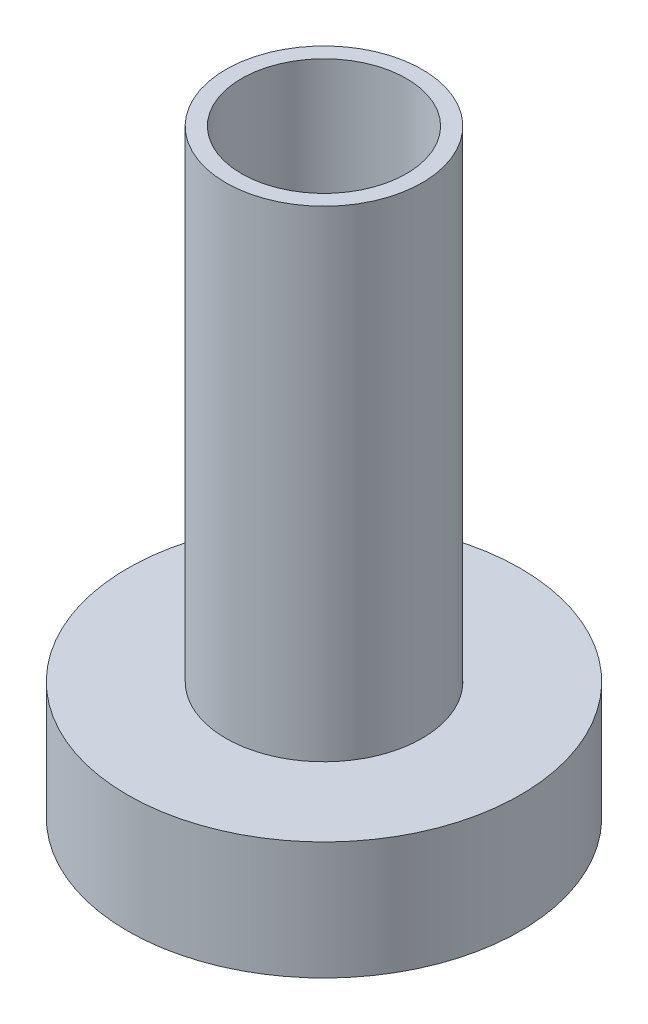
ISO-10303-21;
HEADER;
FILE_DESCRIPTION(('STEP AP214'),'2;1');
FILE_NAME('part.step','',(''),(''),'','','');
FILE_SCHEMA(('AUTOMOTIVE_DESIGN { 1 0 10303 214 1 1 1 1 }'));
ENDSEC;
DATA;
#1=APPLICATION_CONTEXT('core data for automotive mechanical design processes');
#2=APPLICATION_PROTOCOL_DEFINITION('international standard','automotive_design',2000,#1);
#3=PRODUCT_CONTEXT('',#1,'mechanical');
#4=PRODUCT('Part','Part','',(#3));
#5=PRODUCT_RELATED_PRODUCT_CATEGORY('part','',(#4));
#6=PRODUCT_DEFINITION_FORMATION('','',#4);
#7=PRODUCT_DEFINITION_CONTEXT('part definition',#1,'design');
#8=PRODUCT_DEFINITION('design','',#6,#7);
#9=PRODUCT_DEFINITION_SHAPE('','',#8);
#10=(LENGTH_UNIT() NAMED_UNIT(*) SI_UNIT(.MILLI.,.METRE.));
#11=(NAMED_UNIT(*) PLANE_ANGLE_UNIT() SI_UNIT($,.RADIAN.));
#12=(NAMED_UNIT(*) SI_UNIT($,.STERADIAN.) SOLID_ANGLE_UNIT());
#13=UNCERTAINTY_MEASURE_WITH_UNIT(LENGTH_MEASURE(1.E-05),#10,'distance_accuracy_value','');
#14=(GEOMETRIC_REPRESENTATION_CONTEXT(3) GLOBAL_UNCERTAINTY_ASSIGNED_CONTEXT((#13)) GLOBAL_UNIT_ASSIGNED_CONTEXT((#10,
#11,#12)) REPRESENTATION_CONTEXT('',''));
#15=CARTESIAN_POINT('',(0.,0.,0.));
#16=DIRECTION('',(0.,0.,1.));
#17=DIRECTION('',(1.,0.,0.));
#18=AXIS2_PLACEMENT_3D('',#15,#16,#17);
#19=CARTESIAN_POINT('',(0.,-10.,0.));
#20=DIRECTION('',(0.,1.,0.));
#21=DIRECTION('',(0.,0.,1.));
#22=AXIS2_PLACEMENT_3D('',#19,#20,#21);
#23=CYLINDRICAL_SURFACE('',#22,7.);
#24=CARTESIAN_POINT('',(0.,-10.,0.));
#25=DIRECTION('',(0.,1.,0.));
#26=DIRECTION('',(0.,0.,1.));
#27=AXIS2_PLACEMENT_3D('',#24,#25,#26);
#28=CIRCLE('',#27,7.);
#29=CARTESIAN_POINT('',(0.,-10.,7.));
#30=VERTEX_POINT('',#29);
#31=EDGE_CURVE('E11',#30,#30,#28,.T.);
#32=ORIENTED_EDGE('',*,*,#31,.F.);
#33=EDGE_LOOP('',(#32));
#34=FACE_BOUND('',#33,.T.);
#35=CARTESIAN_POINT('',(0.,0.,0.));
#36=DIRECTION('',(0.,1.,0.));
#37=DIRECTION('',(0.,0.,1.));
#38=AXIS2_PLACEMENT_3D('',#35,#36,#37);
#39=CIRCLE('',#38,7.);
#40=CARTESIAN_POINT('',(0.,0.,7.));
#41=VERTEX_POINT('',#40);
#42=EDGE_CURVE('E54',#41,#41,#39,.T.);
#43=ORIENTED_EDGE('',*,*,#42,.T.);
#44=EDGE_LOOP('',(#43));
#45=FACE_BOUND('',#44,.T.);
#46=ADVANCED_FACE('F51',(#34,#45),#23,.F.);
#47=CARTESIAN_POINT('',(0.,-10.,0.));
#48=DIRECTION('',(0.,1.,0.));
#49=DIRECTION('',(0.,0.,1.));
#50=AXIS2_PLACEMENT_3D('',#47,#48,#49);
#51=PLANE('',#50);
#52=ORIENTED_EDGE('',*,*,#31,.T.);
#53=EDGE_LOOP('',(#52));
#54=FACE_BOUND('',#53,.T.);
#55=CARTESIAN_POINT('',(0.,-10.,0.));
#56=DIRECTION('',(0.,-1.,0.));
#57=DIRECTION('',(0.,0.,-1.));
#58=AXIS2_PLACEMENT_3D('',#55,#56,#57);
#59=CIRCLE('',#58,50.);
#60=CARTESIAN_POINT('',(0.,-10.,-50.));
#61=VERTEX_POINT('',#60);
#62=EDGE_CURVE('E66',#61,#61,#59,.T.);
#63=ORIENTED_EDGE('',*,*,#62,.T.);
#64=EDGE_LOOP('',(#63));
#65=FACE_BOUND('',#64,.T.);
#66=ADVANCED_FACE('F89',(#54,#65),#51,.F.);
#67=CARTESIAN_POINT('',(0.,0.,0.));
#68=DIRECTION('',(0.,1.,0.));
#69=DIRECTION('',(0.,0.,1.));
#70=AXIS2_PLACEMENT_3D('',#67,#68,#69);
#71=PLANE('',#70);
#72=ORIENTED_EDGE('',*,*,#42,.F.);
#73=EDGE_LOOP('',(#72));
#74=FACE_BOUND('',#73,.T.);
#75=CARTESIAN_POINT('',(0.,0.,0.));
#76=DIRECTION('',(0.,1.,0.));
#77=DIRECTION('',(0.,0.,1.));
#78=AXIS2_PLACEMENT_3D('',#75,#76,#77);
#79=CIRCLE('',#78,25.);
#80=CARTESIAN_POINT('',(0.,0.,25.));
#81=VERTEX_POINT('',#80);
#82=EDGE_CURVE('E61',#81,#81,#79,.T.);
#83=ORIENTED_EDGE('',*,*,#82,.T.);
#84=EDGE_LOOP('',(#83));
#85=FACE_BOUND('',#84,.T.);
#86=ADVANCED_FACE('F94',(#74,#85),#71,.T.);
#87=CARTESIAN_POINT('',(0.,20.,0.));
#88=DIRECTION('',(0.,-1.,0.));
#89=DIRECTION('',(0.,0.,-1.));
#90=AXIS2_PLACEMENT_3D('',#87,#88,#89);
#91=CYLINDRICAL_SURFACE('',#90,50.);
#92=CARTESIAN_POINT('',(0.,20.,0.));
#93=DIRECTION('',(0.,-1.,0.));
#94=DIRECTION('',(0.,0.,-1.));
#95=AXIS2_PLACEMENT_3D('',#92,#93,#94);
#96=CIRCLE('',#95,50.);
#97=CARTESIAN_POINT('',(0.,20.,-50.));
#98=VERTEX_POINT('',#97);
#99=EDGE_CURVE('E65',#98,#98,#96,.T.);
#100=ORIENTED_EDGE('',*,*,#99,.T.);
#101=EDGE_LOOP('',(#100));
#102=FACE_BOUND('',#101,.T.);
#103=ORIENTED_EDGE('',*,*,#62,.F.);
#104=EDGE_LOOP('',(#103));
#105=FACE_BOUND('',#104,.T.);
#106=ADVANCED_FACE('F85',(#102,#105),#91,.T.);
#107=CARTESIAN_POINT('',(0.,20.,0.));
#108=DIRECTION('',(0.,-1.,0.));
#109=DIRECTION('',(0.,0.,-1.));
#110=AXIS2_PLACEMENT_3D('',#107,#108,#109);
#111=PLANE('',#110);
#112=CARTESIAN_POINT('',(0.,20.,0.));
#113=DIRECTION('',(0.,-1.,0.));
#114=DIRECTION('',(0.,0.,-1.));
#115=AXIS2_PLACEMENT_3D('',#112,#113,#114);
#116=CIRCLE('',#115,25.);
#117=CARTESIAN_POINT('',(0.,20.,-25.));
#118=VERTEX_POINT('',#117);
#119=EDGE_CURVE('E69',#118,#118,#116,.T.);
#120=ORIENTED_EDGE('',*,*,#119,.T.);
#121=EDGE_LOOP('',(#120));
#122=FACE_BOUND('',#121,.T.);
#123=ORIENTED_EDGE('',*,*,#99,.F.);
#124=EDGE_LOOP('',(#123));
#125=FACE_BOUND('',#124,.T.);
#126=ADVANCED_FACE('F75',(#122,#125),#111,.F.);
#127=CARTESIAN_POINT('',(0.,20.,0.));
#128=DIRECTION('',(0.,-1.,0.));
#129=DIRECTION('',(0.,0.,-1.));
#130=AXIS2_PLACEMENT_3D('',#127,#128,#129);
#131=CYLINDRICAL_SURFACE('',#130,25.);
#132=ORIENTED_EDGE('',*,*,#82,.F.);
#133=EDGE_LOOP('',(#132));
#134=FACE_BOUND('',#133,.T.);
#135=ORIENTED_EDGE('',*,*,#119,.F.);
#136=EDGE_LOOP('',(#135));
#137=FACE_BOUND('',#136,.T.);
#138=ADVANCED_FACE('F78',(#134,#137),#131,.F.);
#139=CLOSED_SHELL('',(#46,#66,#86,#106,#126,#138));
#140=MANIFOLD_SOLID_BREP('B2',#139);
#141=CARTESIAN_POINT('',(0.,142.5,0.));
#142=DIRECTION('',(0.,-1.,0.));
#143=DIRECTION('',(0.,0.,-1.));
#144=AXIS2_PLACEMENT_3D('',#141,#142,#143);
#145=CYLINDRICAL_SURFACE('',#144,21.);
#146=CARTESIAN_POINT('',(0.,142.5,0.));
#147=DIRECTION('',(0.,1.,0.));
#148=DIRECTION('',(0.,0.,1.));
#149=AXIS2_PLACEMENT_3D('',#146,#147,#148);
#150=CIRCLE('',#149,21.);
#151=CARTESIAN_POINT('',(0.,142.5,21.));
#152=VERTEX_POINT('',#151);
#153=EDGE_CURVE('E175',#152,#152,#150,.T.);
#154=ORIENTED_EDGE('',*,*,#153,.T.);
#155=EDGE_LOOP('',(#154));
#156=FACE_BOUND('',#155,.T.);
#157=CARTESIAN_POINT('',(0.,0.,0.));
#158=DIRECTION('',(0.,1.,0.));
#159=DIRECTION('',(0.,0.,1.));
#160=AXIS2_PLACEMENT_3D('',#157,#158,#159);
#161=CIRCLE('',#160,21.);
#162=CARTESIAN_POINT('',(0.,0.,21.));
#163=VERTEX_POINT('',#162);
#164=EDGE_CURVE('E181',#163,#163,#161,.T.);
#165=ORIENTED_EDGE('',*,*,#164,.F.);
#166=EDGE_LOOP('',(#165));
#167=FACE_BOUND('',#166,.T.);
#168=ADVANCED_FACE('F168',(#156,#167),#145,.F.);
#169=CARTESIAN_POINT('',(0.,142.5,0.));
#170=DIRECTION('',(0.,-1.,0.));
#171=DIRECTION('',(0.,0.,-1.));
#172=AXIS2_PLACEMENT_3D('',#169,#170,#171);
#173=CYLINDRICAL_SURFACE('',#172,25.);
#174=CARTESIAN_POINT('',(0.,142.5,0.));
#175=DIRECTION('',(0.,1.,0.));
#176=DIRECTION('',(0.,0.,1.));
#177=AXIS2_PLACEMENT_3D('',#174,#175,#176);
#178=CIRCLE('',#177,25.);
#179=CARTESIAN_POINT('',(0.,142.5,25.));
#180=VERTEX_POINT('',#179);
#181=EDGE_CURVE('E50',#180,#180,#178,.T.);
#182=ORIENTED_EDGE('',*,*,#181,.F.);
#183=EDGE_LOOP('',(#182));
#184=FACE_BOUND('',#183,.T.);
#185=CARTESIAN_POINT('',(0.,0.,0.));
#186=DIRECTION('',(0.,1.,0.));
#187=DIRECTION('',(0.,0.,1.));
#188=AXIS2_PLACEMENT_3D('',#185,#186,#187);
#189=CIRCLE('',#188,25.);
#190=CARTESIAN_POINT('',(0.,0.,25.));
#191=VERTEX_POINT('',#190);
#192=EDGE_CURVE('E171',#191,#191,#189,.T.);
#193=ORIENTED_EDGE('',*,*,#192,.T.);
#194=EDGE_LOOP('',(#193));
#195=FACE_BOUND('',#194,.T.);
#196=ADVANCED_FACE('F188',(#184,#195),#173,.T.);
#197=CARTESIAN_POINT('',(0.,142.5,0.));
#198=DIRECTION('',(0.,1.,0.));
#199=DIRECTION('',(0.,0.,1.));
#200=AXIS2_PLACEMENT_3D('',#197,#198,#199);
#201=PLANE('',#200);
#202=ORIENTED_EDGE('',*,*,#153,.F.);
#203=EDGE_LOOP('',(#202));
#204=FACE_BOUND('',#203,.T.);
#205=ORIENTED_EDGE('',*,*,#181,.T.);
#206=EDGE_LOOP('',(#205));
#207=FACE_BOUND('',#206,.T.);
#208=ADVANCED_FACE('F192',(#204,#207),#201,.T.);
#209=CARTESIAN_POINT('',(0.,0.,0.));
#210=DIRECTION('',(0.,1.,0.));
#211=DIRECTION('',(0.,0.,1.));
#212=AXIS2_PLACEMENT_3D('',#209,#210,#211);
#213=PLANE('',#212);
#214=ORIENTED_EDGE('',*,*,#164,.T.);
#215=EDGE_LOOP('',(#214));
#216=FACE_BOUND('',#215,.T.);
#217=ORIENTED_EDGE('',*,*,#192,.F.);
#218=EDGE_LOOP('',(#217));
#219=FACE_BOUND('',#218,.T.);
#220=ADVANCED_FACE('F190',(#216,#219),#213,.F.);
#221=CLOSED_SHELL('',(#168,#196,#208,#220));
#222=MANIFOLD_SOLID_BREP('B6',#221);
#223=ADVANCED_BREP_SHAPE_REPRESENTATION('',(#18,#140,#222),#14);
#224=SHAPE_DEFINITION_REPRESENTATION(#9,#223);
ENDSEC;
END-ISO-10303-21;
